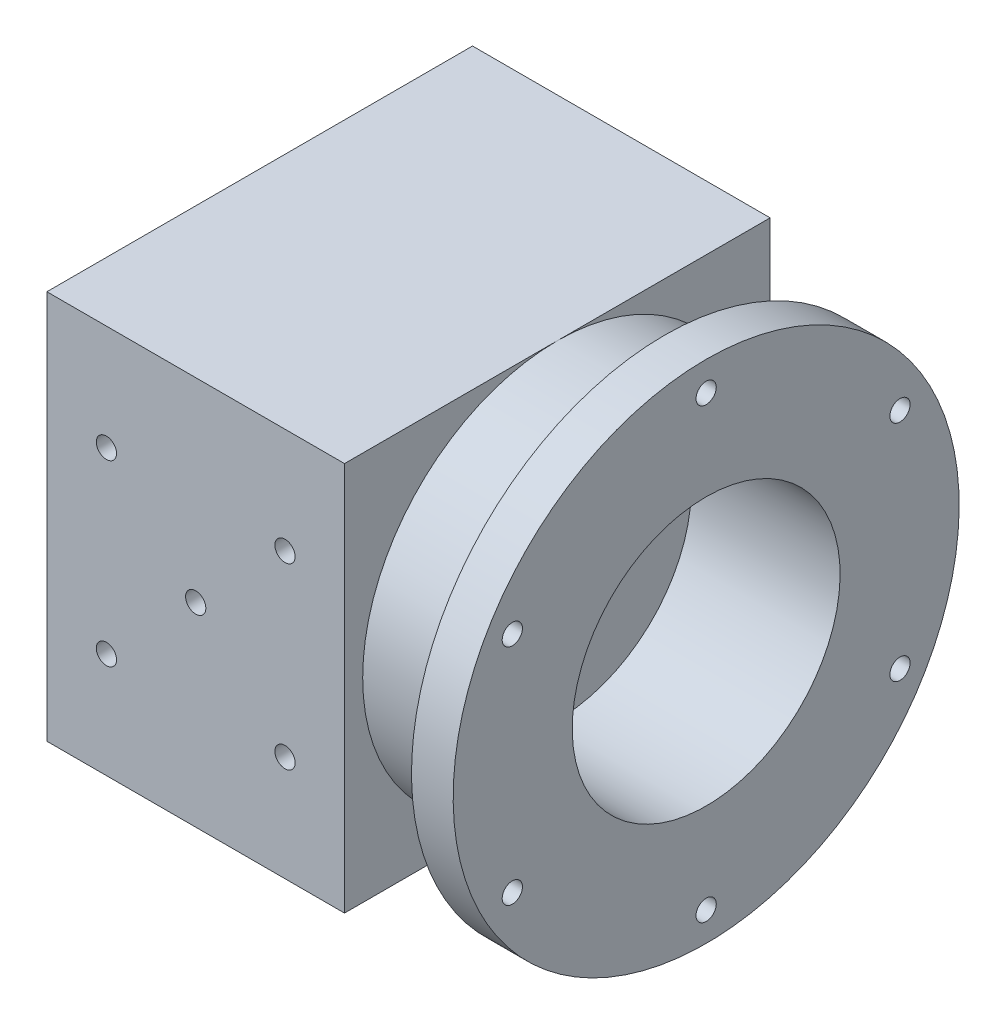
ISO-10303-21;
HEADER;
FILE_DESCRIPTION(('STEP AP214'),'2;1');
FILE_NAME('part.step','',(''),(''),'','','');
FILE_SCHEMA(('AUTOMOTIVE_DESIGN { 1 0 10303 214 1 1 1 1 }'));
ENDSEC;
DATA;
#1=APPLICATION_CONTEXT('core data for automotive mechanical design processes');
#2=APPLICATION_PROTOCOL_DEFINITION('international standard','automotive_design',2000,#1);
#3=PRODUCT_CONTEXT('',#1,'mechanical');
#4=PRODUCT('Part','Part','',(#3));
#5=PRODUCT_RELATED_PRODUCT_CATEGORY('part','',(#4));
#6=PRODUCT_DEFINITION_FORMATION('','',#4);
#7=PRODUCT_DEFINITION_CONTEXT('part definition',#1,'design');
#8=PRODUCT_DEFINITION('design','',#6,#7);
#9=PRODUCT_DEFINITION_SHAPE('','',#8);
#10=(LENGTH_UNIT() NAMED_UNIT(*) SI_UNIT(.MILLI.,.METRE.));
#11=(NAMED_UNIT(*) PLANE_ANGLE_UNIT() SI_UNIT($,.RADIAN.));
#12=(NAMED_UNIT(*) SI_UNIT($,.STERADIAN.) SOLID_ANGLE_UNIT());
#13=UNCERTAINTY_MEASURE_WITH_UNIT(LENGTH_MEASURE(1.E-05),#10,'distance_accuracy_value','');
#14=(GEOMETRIC_REPRESENTATION_CONTEXT(3) GLOBAL_UNCERTAINTY_ASSIGNED_CONTEXT((#13)) GLOBAL_UNIT_ASSIGNED_CONTEXT((#10,
#11,#12)) REPRESENTATION_CONTEXT('',''));
#15=CARTESIAN_POINT('',(0.,0.,0.));
#16=DIRECTION('',(0.,0.,1.));
#17=DIRECTION('',(1.,0.,0.));
#18=AXIS2_PLACEMENT_3D('',#15,#16,#17);
#19=CARTESIAN_POINT('',(50.,0.,0.));
#20=DIRECTION('',(-1.,0.,0.));
#21=DIRECTION('',(0.,-1.,0.));
#22=AXIS2_PLACEMENT_3D('',#19,#20,#21);
#23=CYLINDRICAL_SURFACE('',#22,32.7);
#24=CARTESIAN_POINT('',(25.,0.,0.));
#25=DIRECTION('',(1.,0.,0.));
#26=DIRECTION('',(0.,1.,0.));
#27=AXIS2_PLACEMENT_3D('',#24,#25,#26);
#28=CIRCLE('',#27,32.7);
#29=CARTESIAN_POINT('',(25.,32.7,0.));
#30=VERTEX_POINT('',#29);
#31=EDGE_CURVE('E47',#30,#30,#28,.T.);
#32=ORIENTED_EDGE('',*,*,#31,.T.);
#33=EDGE_LOOP('',(#32));
#34=FACE_BOUND('',#33,.T.);
#35=CARTESIAN_POINT('',(43.,0.,0.));
#36=DIRECTION('',(1.,0.,0.));
#37=DIRECTION('',(0.,1.,0.));
#38=AXIS2_PLACEMENT_3D('',#35,#36,#37);
#39=CIRCLE('',#38,32.7);
#40=CARTESIAN_POINT('',(43.,32.7,0.));
#41=VERTEX_POINT('',#40);
#42=EDGE_CURVE('E11',#41,#41,#39,.T.);
#43=ORIENTED_EDGE('',*,*,#42,.F.);
#44=EDGE_LOOP('',(#43));
#45=FACE_BOUND('',#44,.T.);
#46=ADVANCED_FACE('F41',(#34,#45),#23,.T.);
#47=CARTESIAN_POINT('',(50.,0.,0.));
#48=DIRECTION('',(1.,0.,0.));
#49=DIRECTION('',(0.,1.,0.));
#50=AXIS2_PLACEMENT_3D('',#47,#48,#49);
#51=PLANE('',#50);
#52=CARTESIAN_POINT('',(50.,37.6,0.));
#53=DIRECTION('',(1.,0.,0.));
#54=DIRECTION('',(0.,0.,-1.));
#55=AXIS2_PLACEMENT_3D('',#52,#53,#54);
#56=CIRCLE('',#55,1.69999999999999);
#57=CARTESIAN_POINT('',(50.,37.6,-1.69999999999999));
#58=VERTEX_POINT('',#57);
#59=EDGE_CURVE('E99',#58,#58,#56,.T.);
#60=ORIENTED_EDGE('',*,*,#59,.F.);
#61=EDGE_LOOP('',(#60));
#62=FACE_BOUND('',#61,.T.);
#63=CARTESIAN_POINT('',(50.,18.8000000000014,-32.5625551822957));
#64=DIRECTION('',(1.,0.,0.));
#65=DIRECTION('',(0.,0.,-1.));
#66=AXIS2_PLACEMENT_3D('',#63,#64,#65);
#67=CIRCLE('',#66,1.69999999999999);
#68=CARTESIAN_POINT('',(50.,18.8000000000014,-34.2625551822957));
#69=VERTEX_POINT('',#68);
#70=EDGE_CURVE('E93',#69,#69,#67,.T.);
#71=ORIENTED_EDGE('',*,*,#70,.F.);
#72=EDGE_LOOP('',(#71));
#73=FACE_BOUND('',#72,.T.);
#74=CARTESIAN_POINT('',(50.,-18.7999999999986,-32.5625551822973));
#75=DIRECTION('',(1.,0.,0.));
#76=DIRECTION('',(0.,0.,-1.));
#77=AXIS2_PLACEMENT_3D('',#74,#75,#76);
#78=CIRCLE('',#77,1.69999999999999);
#79=CARTESIAN_POINT('',(50.,-18.7999999999986,-34.2625551822973));
#80=VERTEX_POINT('',#79);
#81=EDGE_CURVE('E87',#80,#80,#78,.T.);
#82=ORIENTED_EDGE('',*,*,#81,.F.);
#83=EDGE_LOOP('',(#82));
#84=FACE_BOUND('',#83,.T.);
#85=CARTESIAN_POINT('',(50.,-37.6,-3.19155473092361E-12));
#86=DIRECTION('',(1.,0.,0.));
#87=DIRECTION('',(0.,0.,-1.));
#88=AXIS2_PLACEMENT_3D('',#85,#86,#87);
#89=CIRCLE('',#88,1.69999999999999);
#90=CARTESIAN_POINT('',(50.,-37.6,-1.70000000000318));
#91=VERTEX_POINT('',#90);
#92=EDGE_CURVE('E81',#91,#91,#89,.T.);
#93=ORIENTED_EDGE('',*,*,#92,.F.);
#94=EDGE_LOOP('',(#93));
#95=FACE_BOUND('',#94,.T.);
#96=CARTESIAN_POINT('',(50.,-18.8000000000014,32.5625551822925));
#97=DIRECTION('',(1.,0.,0.));
#98=DIRECTION('',(0.,0.,-1.));
#99=AXIS2_PLACEMENT_3D('',#96,#97,#98);
#100=CIRCLE('',#99,1.69999999999999);
#101=CARTESIAN_POINT('',(50.,-18.8000000000014,30.8625551822925));
#102=VERTEX_POINT('',#101);
#103=EDGE_CURVE('E75',#102,#102,#100,.T.);
#104=ORIENTED_EDGE('',*,*,#103,.F.);
#105=EDGE_LOOP('',(#104));
#106=FACE_BOUND('',#105,.T.);
#107=CARTESIAN_POINT('',(50.,18.7999999999986,32.5625551822941));
#108=DIRECTION('',(1.,0.,0.));
#109=DIRECTION('',(0.,0.,-1.));
#110=AXIS2_PLACEMENT_3D('',#107,#108,#109);
#111=CIRCLE('',#110,1.69999999999999);
#112=CARTESIAN_POINT('',(50.,18.7999999999986,30.8625551822941));
#113=VERTEX_POINT('',#112);
#114=EDGE_CURVE('E69',#113,#113,#111,.T.);
#115=ORIENTED_EDGE('',*,*,#114,.F.);
#116=EDGE_LOOP('',(#115));
#117=FACE_BOUND('',#116,.T.);
#118=CARTESIAN_POINT('',(50.,0.,0.));
#119=DIRECTION('',(1.,0.,0.));
#120=DIRECTION('',(0.,1.,0.));
#121=AXIS2_PLACEMENT_3D('',#118,#119,#120);
#122=CIRCLE('',#121,22.5);
#123=CARTESIAN_POINT('',(50.,22.5,0.));
#124=VERTEX_POINT('',#123);
#125=EDGE_CURVE('E51',#124,#124,#122,.T.);
#126=ORIENTED_EDGE('',*,*,#125,.F.);
#127=EDGE_LOOP('',(#126));
#128=FACE_BOUND('',#127,.T.);
#129=CARTESIAN_POINT('',(50.,0.,0.));
#130=DIRECTION('',(1.,0.,0.));
#131=DIRECTION('',(0.,1.,0.));
#132=AXIS2_PLACEMENT_3D('',#129,#130,#131);
#133=CIRCLE('',#132,42.5);
#134=CARTESIAN_POINT('',(50.,42.5,0.));
#135=VERTEX_POINT('',#134);
#136=EDGE_CURVE('E61',#135,#135,#133,.T.);
#137=ORIENTED_EDGE('',*,*,#136,.T.);
#138=EDGE_LOOP('',(#137));
#139=FACE_BOUND('',#138,.T.);
#140=ADVANCED_FACE('F105',(#62,#73,#84,#95,#106,#117,#128,#139),#51,.T.);
#141=CARTESIAN_POINT('',(25.,0.,0.));
#142=DIRECTION('',(1.,0.,0.));
#143=DIRECTION('',(0.,1.,0.));
#144=AXIS2_PLACEMENT_3D('',#141,#142,#143);
#145=PLANE('',#144);
#146=ORIENTED_EDGE('',*,*,#31,.F.);
#147=EDGE_LOOP('',(#146));
#148=FACE_BOUND('',#147,.T.);
#149=CARTESIAN_POINT('',(25.,0.,0.));
#150=DIRECTION('',(1.,0.,0.));
#151=DIRECTION('',(0.,1.,0.));
#152=AXIS2_PLACEMENT_3D('',#149,#150,#151);
#153=CIRCLE('',#152,22.5);
#154=CARTESIAN_POINT('',(25.,22.5,0.));
#155=VERTEX_POINT('',#154);
#156=EDGE_CURVE('E55',#155,#155,#153,.T.);
#157=ORIENTED_EDGE('',*,*,#156,.T.);
#158=EDGE_LOOP('',(#157));
#159=FACE_BOUND('',#158,.T.);
#160=ADVANCED_FACE('F108',(#148,#159),#145,.F.);
#161=CARTESIAN_POINT('',(50.,0.,0.));
#162=DIRECTION('',(-1.,0.,0.));
#163=DIRECTION('',(0.,-1.,0.));
#164=AXIS2_PLACEMENT_3D('',#161,#162,#163);
#165=CYLINDRICAL_SURFACE('',#164,22.5);
#166=ORIENTED_EDGE('',*,*,#125,.T.);
#167=EDGE_LOOP('',(#166));
#168=FACE_BOUND('',#167,.T.);
#169=ORIENTED_EDGE('',*,*,#156,.F.);
#170=EDGE_LOOP('',(#169));
#171=FACE_BOUND('',#170,.T.);
#172=ADVANCED_FACE('F127',(#168,#171),#165,.F.);
#173=CARTESIAN_POINT('',(43.,0.,0.));
#174=DIRECTION('',(1.,0.,0.));
#175=DIRECTION('',(0.,1.,0.));
#176=AXIS2_PLACEMENT_3D('',#173,#174,#175);
#177=CYLINDRICAL_SURFACE('',#176,42.5);
#178=CARTESIAN_POINT('',(43.,0.,0.));
#179=DIRECTION('',(1.,0.,0.));
#180=DIRECTION('',(0.,1.,0.));
#181=AXIS2_PLACEMENT_3D('',#178,#179,#180);
#182=CIRCLE('',#181,42.5);
#183=CARTESIAN_POINT('',(43.,42.5,0.));
#184=VERTEX_POINT('',#183);
#185=EDGE_CURVE('E59',#184,#184,#182,.T.);
#186=ORIENTED_EDGE('',*,*,#185,.T.);
#187=EDGE_LOOP('',(#186));
#188=FACE_BOUND('',#187,.T.);
#189=ORIENTED_EDGE('',*,*,#136,.F.);
#190=EDGE_LOOP('',(#189));
#191=FACE_BOUND('',#190,.T.);
#192=ADVANCED_FACE('F124',(#188,#191),#177,.T.);
#193=CARTESIAN_POINT('',(43.,0.,0.));
#194=DIRECTION('',(1.,0.,0.));
#195=DIRECTION('',(0.,1.,0.));
#196=AXIS2_PLACEMENT_3D('',#193,#194,#195);
#197=PLANE('',#196);
#198=CARTESIAN_POINT('',(43.,37.6,0.));
#199=DIRECTION('',(1.,0.,0.));
#200=DIRECTION('',(0.,1.,0.));
#201=AXIS2_PLACEMENT_3D('',#198,#199,#200);
#202=CIRCLE('',#201,1.69999999999999);
#203=CARTESIAN_POINT('',(43.,39.3,0.));
#204=VERTEX_POINT('',#203);
#205=EDGE_CURVE('E96',#204,#204,#202,.T.);
#206=ORIENTED_EDGE('',*,*,#205,.T.);
#207=EDGE_LOOP('',(#206));
#208=FACE_BOUND('',#207,.T.);
#209=CARTESIAN_POINT('',(43.,18.8000000000014,-32.5625551822957));
#210=DIRECTION('',(1.,0.,0.));
#211=DIRECTION('',(0.,1.,0.));
#212=AXIS2_PLACEMENT_3D('',#209,#210,#211);
#213=CIRCLE('',#212,1.69999999999999);
#214=CARTESIAN_POINT('',(43.,20.5000000000014,-32.5625551822957));
#215=VERTEX_POINT('',#214);
#216=EDGE_CURVE('E90',#215,#215,#213,.T.);
#217=ORIENTED_EDGE('',*,*,#216,.T.);
#218=EDGE_LOOP('',(#217));
#219=FACE_BOUND('',#218,.T.);
#220=CARTESIAN_POINT('',(43.,-18.7999999999986,-32.5625551822973));
#221=DIRECTION('',(1.,0.,0.));
#222=DIRECTION('',(0.,1.,0.));
#223=AXIS2_PLACEMENT_3D('',#220,#221,#222);
#224=CIRCLE('',#223,1.69999999999999);
#225=CARTESIAN_POINT('',(43.,-17.0999999999986,-32.5625551822973));
#226=VERTEX_POINT('',#225);
#227=EDGE_CURVE('E84',#226,#226,#224,.T.);
#228=ORIENTED_EDGE('',*,*,#227,.T.);
#229=EDGE_LOOP('',(#228));
#230=FACE_BOUND('',#229,.T.);
#231=CARTESIAN_POINT('',(43.,-37.6,-3.19155473092361E-12));
#232=DIRECTION('',(1.,0.,0.));
#233=DIRECTION('',(0.,1.,0.));
#234=AXIS2_PLACEMENT_3D('',#231,#232,#233);
#235=CIRCLE('',#234,1.69999999999999);
#236=CARTESIAN_POINT('',(43.,-35.9,-3.19155473092361E-12));
#237=VERTEX_POINT('',#236);
#238=EDGE_CURVE('E78',#237,#237,#235,.T.);
#239=ORIENTED_EDGE('',*,*,#238,.T.);
#240=EDGE_LOOP('',(#239));
#241=FACE_BOUND('',#240,.T.);
#242=CARTESIAN_POINT('',(43.,-18.8000000000014,32.5625551822925));
#243=DIRECTION('',(1.,0.,0.));
#244=DIRECTION('',(0.,1.,0.));
#245=AXIS2_PLACEMENT_3D('',#242,#243,#244);
#246=CIRCLE('',#245,1.69999999999999);
#247=CARTESIAN_POINT('',(43.,-17.1000000000014,32.5625551822925));
#248=VERTEX_POINT('',#247);
#249=EDGE_CURVE('E72',#248,#248,#246,.T.);
#250=ORIENTED_EDGE('',*,*,#249,.T.);
#251=EDGE_LOOP('',(#250));
#252=FACE_BOUND('',#251,.T.);
#253=CARTESIAN_POINT('',(43.,18.7999999999986,32.5625551822941));
#254=DIRECTION('',(1.,0.,0.));
#255=DIRECTION('',(0.,1.,0.));
#256=AXIS2_PLACEMENT_3D('',#253,#254,#255);
#257=CIRCLE('',#256,1.69999999999999);
#258=CARTESIAN_POINT('',(43.,20.4999999999986,32.5625551822941));
#259=VERTEX_POINT('',#258);
#260=EDGE_CURVE('E64',#259,#259,#257,.T.);
#261=ORIENTED_EDGE('',*,*,#260,.T.);
#262=EDGE_LOOP('',(#261));
#263=FACE_BOUND('',#262,.T.);
#264=ORIENTED_EDGE('',*,*,#42,.T.);
#265=EDGE_LOOP('',(#264));
#266=FACE_BOUND('',#265,.T.);
#267=ORIENTED_EDGE('',*,*,#185,.F.);
#268=EDGE_LOOP('',(#267));
#269=FACE_BOUND('',#268,.T.);
#270=ADVANCED_FACE('F126',(#208,#219,#230,#241,#252,#263,#266,#269),#197,.F.);
#271=CARTESIAN_POINT('',(50.,18.7999999999986,32.5625551822941));
#272=DIRECTION('',(1.,0.,0.));
#273=DIRECTION('',(0.,0.,-1.));
#274=AXIS2_PLACEMENT_3D('',#271,#272,#273);
#275=CYLINDRICAL_SURFACE('',#274,1.69999999999999);
#276=ORIENTED_EDGE('',*,*,#260,.F.);
#277=EDGE_LOOP('',(#276));
#278=FACE_BOUND('',#277,.T.);
#279=ORIENTED_EDGE('',*,*,#114,.T.);
#280=EDGE_LOOP('',(#279));
#281=FACE_BOUND('',#280,.T.);
#282=ADVANCED_FACE('F134',(#278,#281),#275,.F.);
#283=CARTESIAN_POINT('',(50.,-18.8000000000014,32.5625551822925));
#284=DIRECTION('',(1.,0.,0.));
#285=DIRECTION('',(0.,0.,-1.));
#286=AXIS2_PLACEMENT_3D('',#283,#284,#285);
#287=CYLINDRICAL_SURFACE('',#286,1.69999999999999);
#288=ORIENTED_EDGE('',*,*,#249,.F.);
#289=EDGE_LOOP('',(#288));
#290=FACE_BOUND('',#289,.T.);
#291=ORIENTED_EDGE('',*,*,#103,.T.);
#292=EDGE_LOOP('',(#291));
#293=FACE_BOUND('',#292,.T.);
#294=ADVANCED_FACE('F185',(#290,#293),#287,.F.);
#295=CARTESIAN_POINT('',(50.,-37.6,-3.19155473092361E-12));
#296=DIRECTION('',(1.,0.,0.));
#297=DIRECTION('',(0.,0.,-1.));
#298=AXIS2_PLACEMENT_3D('',#295,#296,#297);
#299=CYLINDRICAL_SURFACE('',#298,1.69999999999999);
#300=ORIENTED_EDGE('',*,*,#238,.F.);
#301=EDGE_LOOP('',(#300));
#302=FACE_BOUND('',#301,.T.);
#303=ORIENTED_EDGE('',*,*,#92,.T.);
#304=EDGE_LOOP('',(#303));
#305=FACE_BOUND('',#304,.T.);
#306=ADVANCED_FACE('F194',(#302,#305),#299,.F.);
#307=CARTESIAN_POINT('',(50.,-18.7999999999986,-32.5625551822973));
#308=DIRECTION('',(1.,0.,0.));
#309=DIRECTION('',(0.,0.,-1.));
#310=AXIS2_PLACEMENT_3D('',#307,#308,#309);
#311=CYLINDRICAL_SURFACE('',#310,1.69999999999999);
#312=ORIENTED_EDGE('',*,*,#227,.F.);
#313=EDGE_LOOP('',(#312));
#314=FACE_BOUND('',#313,.T.);
#315=ORIENTED_EDGE('',*,*,#81,.T.);
#316=EDGE_LOOP('',(#315));
#317=FACE_BOUND('',#316,.T.);
#318=ADVANCED_FACE('F203',(#314,#317),#311,.F.);
#319=CARTESIAN_POINT('',(50.,18.8000000000014,-32.5625551822957));
#320=DIRECTION('',(1.,0.,0.));
#321=DIRECTION('',(0.,0.,-1.));
#322=AXIS2_PLACEMENT_3D('',#319,#320,#321);
#323=CYLINDRICAL_SURFACE('',#322,1.69999999999999);
#324=ORIENTED_EDGE('',*,*,#216,.F.);
#325=EDGE_LOOP('',(#324));
#326=FACE_BOUND('',#325,.T.);
#327=ORIENTED_EDGE('',*,*,#70,.T.);
#328=EDGE_LOOP('',(#327));
#329=FACE_BOUND('',#328,.T.);
#330=ADVANCED_FACE('F212',(#326,#329),#323,.F.);
#331=CARTESIAN_POINT('',(50.,37.6,0.));
#332=DIRECTION('',(1.,0.,0.));
#333=DIRECTION('',(0.,0.,-1.));
#334=AXIS2_PLACEMENT_3D('',#331,#332,#333);
#335=CYLINDRICAL_SURFACE('',#334,1.69999999999999);
#336=ORIENTED_EDGE('',*,*,#205,.F.);
#337=EDGE_LOOP('',(#336));
#338=FACE_BOUND('',#337,.T.);
#339=ORIENTED_EDGE('',*,*,#59,.T.);
#340=EDGE_LOOP('',(#339));
#341=FACE_BOUND('',#340,.T.);
#342=ADVANCED_FACE('F103',(#338,#341),#335,.F.);
#343=CLOSED_SHELL('',(#46,#140,#160,#172,#192,#270,#282,#294,#306,#318,#330,#342));
#344=MANIFOLD_SOLID_BREP('B2',#343);
#345=CARTESIAN_POINT('',(0.,0.,35.75));
#346=DIRECTION('',(0.,0.,-1.));
#347=DIRECTION('',(-1.,0.,0.));
#348=AXIS2_PLACEMENT_3D('',#345,#346,#347);
#349=PLANE('',#348);
#350=CARTESIAN_POINT('',(15.,15.,35.75));
#351=DIRECTION('',(0.,0.,1.));
#352=DIRECTION('',(1.,0.,0.));
#353=AXIS2_PLACEMENT_3D('',#350,#351,#352);
#354=CIRCLE('',#353,1.69999999999999);
#355=CARTESIAN_POINT('',(16.7,15.,35.75));
#356=VERTEX_POINT('',#355);
#357=EDGE_CURVE('E365',#356,#356,#354,.T.);
#358=ORIENTED_EDGE('',*,*,#357,.F.);
#359=EDGE_LOOP('',(#358));
#360=FACE_BOUND('',#359,.T.);
#361=CARTESIAN_POINT('',(-15.,-15.,35.75));
#362=DIRECTION('',(0.,0.,1.));
#363=DIRECTION('',(1.,0.,0.));
#364=AXIS2_PLACEMENT_3D('',#361,#362,#363);
#365=CIRCLE('',#364,1.69999999999999);
#366=CARTESIAN_POINT('',(-13.3,-15.,35.75));
#367=VERTEX_POINT('',#366);
#368=EDGE_CURVE('E359',#367,#367,#365,.T.);
#369=ORIENTED_EDGE('',*,*,#368,.F.);
#370=EDGE_LOOP('',(#369));
#371=FACE_BOUND('',#370,.T.);
#372=CARTESIAN_POINT('',(-15.,15.,35.75));
#373=DIRECTION('',(0.,0.,1.));
#374=DIRECTION('',(1.,0.,0.));
#375=AXIS2_PLACEMENT_3D('',#372,#373,#374);
#376=CIRCLE('',#375,1.69999999999999);
#377=CARTESIAN_POINT('',(-13.3,15.,35.75));
#378=VERTEX_POINT('',#377);
#379=EDGE_CURVE('E353',#378,#378,#376,.T.);
#380=ORIENTED_EDGE('',*,*,#379,.F.);
#381=EDGE_LOOP('',(#380));
#382=FACE_BOUND('',#381,.T.);
#383=CARTESIAN_POINT('',(15.,-15.,35.75));
#384=DIRECTION('',(0.,0.,1.));
#385=DIRECTION('',(1.,0.,0.));
#386=AXIS2_PLACEMENT_3D('',#383,#384,#385);
#387=CIRCLE('',#386,1.69999999999999);
#388=CARTESIAN_POINT('',(16.7,-15.,35.75));
#389=VERTEX_POINT('',#388);
#390=EDGE_CURVE('E347',#389,#389,#387,.T.);
#391=ORIENTED_EDGE('',*,*,#390,.F.);
#392=EDGE_LOOP('',(#391));
#393=FACE_BOUND('',#392,.T.);
#394=DIRECTION('',(0.,1.,0.));
#395=VECTOR('',#394,1.);
#396=CARTESIAN_POINT('',(25.,32.7,35.75));
#397=LINE('',#396,#395);
#398=CARTESIAN_POINT('',(25.,-32.7,35.75));
#399=VERTEX_POINT('',#398);
#400=CARTESIAN_POINT('',(25.,32.7,35.75));
#401=VERTEX_POINT('',#400);
#402=EDGE_CURVE('E315',#399,#401,#397,.T.);
#403=ORIENTED_EDGE('',*,*,#402,.T.);
#404=DIRECTION('',(-1.,0.,0.));
#405=VECTOR('',#404,1.);
#406=CARTESIAN_POINT('',(-25.,32.7,35.75));
#407=LINE('',#406,#405);
#408=CARTESIAN_POINT('',(-25.,32.7,35.75));
#409=VERTEX_POINT('',#408);
#410=EDGE_CURVE('E310',#401,#409,#407,.T.);
#411=ORIENTED_EDGE('',*,*,#410,.T.);
#412=DIRECTION('',(0.,-1.,0.));
#413=VECTOR('',#412,1.);
#414=CARTESIAN_POINT('',(-25.,32.7,35.75));
#415=LINE('',#414,#413);
#416=CARTESIAN_POINT('',(-25.,-32.7,35.75));
#417=VERTEX_POINT('',#416);
#418=EDGE_CURVE('E313',#409,#417,#415,.T.);
#419=ORIENTED_EDGE('',*,*,#418,.T.);
#420=DIRECTION('',(1.,0.,0.));
#421=VECTOR('',#420,1.);
#422=CARTESIAN_POINT('',(25.,-32.7,35.75));
#423=LINE('',#422,#421);
#424=EDGE_CURVE('E280',#417,#399,#423,.T.);
#425=ORIENTED_EDGE('',*,*,#424,.T.);
#426=EDGE_LOOP('',(#403,#411,#419,#425));
#427=FACE_BOUND('',#426,.T.);
#428=CARTESIAN_POINT('',(0.,0.,35.75));
#429=DIRECTION('',(0.,0.,1.));
#430=DIRECTION('',(1.,0.,0.));
#431=AXIS2_PLACEMENT_3D('',#428,#429,#430);
#432=CIRCLE('',#431,1.69999999999999);
#433=CARTESIAN_POINT('',(1.69999999999999,0.,35.75));
#434=VERTEX_POINT('',#433);
#435=EDGE_CURVE('E344',#434,#434,#432,.T.);
#436=ORIENTED_EDGE('',*,*,#435,.F.);
#437=EDGE_LOOP('',(#436));
#438=FACE_BOUND('',#437,.T.);
#439=ADVANCED_FACE('F262',(#360,#371,#382,#393,#427,#438),#349,.F.);
#440=CARTESIAN_POINT('',(25.,32.7,35.75));
#441=DIRECTION('',(-1.,0.,0.));
#442=DIRECTION('',(0.,0.,1.));
#443=AXIS2_PLACEMENT_3D('',#440,#441,#442);
#444=PLANE('',#443);
#445=DIRECTION('',(0.,1.,0.));
#446=VECTOR('',#445,1.);
#447=CARTESIAN_POINT('',(25.,32.7,-35.75));
#448=LINE('',#447,#446);
#449=CARTESIAN_POINT('',(25.,-32.7,-35.75));
#450=VERTEX_POINT('',#449);
#451=CARTESIAN_POINT('',(25.,32.7,-35.75));
#452=VERTEX_POINT('',#451);
#453=EDGE_CURVE('E328',#450,#452,#448,.T.);
#454=ORIENTED_EDGE('',*,*,#453,.T.);
#455=DIRECTION('',(0.,0.,-1.));
#456=VECTOR('',#455,1.);
#457=CARTESIAN_POINT('',(25.,32.7,35.75));
#458=LINE('',#457,#456);
#459=EDGE_CURVE('E39',#401,#452,#458,.T.);
#460=ORIENTED_EDGE('',*,*,#459,.F.);
#461=ORIENTED_EDGE('',*,*,#402,.F.);
#462=DIRECTION('',(0.,0.,-1.));
#463=VECTOR('',#462,1.);
#464=CARTESIAN_POINT('',(25.,-32.7,35.75));
#465=LINE('',#464,#463);
#466=EDGE_CURVE('E324',#399,#450,#465,.T.);
#467=ORIENTED_EDGE('',*,*,#466,.T.);
#468=EDGE_LOOP('',(#454,#460,#461,#467));
#469=FACE_BOUND('',#468,.T.);
#470=ADVANCED_FACE('F264',(#469),#444,.F.);
#471=CARTESIAN_POINT('',(-25.,32.7,35.75));
#472=DIRECTION('',(0.,-1.,0.));
#473=DIRECTION('',(0.,0.,-1.));
#474=AXIS2_PLACEMENT_3D('',#471,#472,#473);
#475=PLANE('',#474);
#476=DIRECTION('',(-1.,0.,0.));
#477=VECTOR('',#476,1.);
#478=CARTESIAN_POINT('',(-25.,32.7,-35.75));
#479=LINE('',#478,#477);
#480=CARTESIAN_POINT('',(-25.,32.7,-35.75));
#481=VERTEX_POINT('',#480);
#482=EDGE_CURVE('E319',#452,#481,#479,.T.);
#483=ORIENTED_EDGE('',*,*,#482,.T.);
#484=DIRECTION('',(0.,0.,-1.));
#485=VECTOR('',#484,1.);
#486=CARTESIAN_POINT('',(-25.,32.7,35.75));
#487=LINE('',#486,#485);
#488=EDGE_CURVE('E272',#409,#481,#487,.T.);
#489=ORIENTED_EDGE('',*,*,#488,.F.);
#490=ORIENTED_EDGE('',*,*,#410,.F.);
#491=ORIENTED_EDGE('',*,*,#459,.T.);
#492=EDGE_LOOP('',(#483,#489,#490,#491));
#493=FACE_BOUND('',#492,.T.);
#494=ADVANCED_FACE('F318',(#493),#475,.F.);
#495=CARTESIAN_POINT('',(-25.,32.7,35.75));
#496=DIRECTION('',(1.,0.,0.));
#497=DIRECTION('',(0.,1.,0.));
#498=AXIS2_PLACEMENT_3D('',#495,#496,#497);
#499=PLANE('',#498);
#500=DIRECTION('',(0.,-1.,0.));
#501=VECTOR('',#500,1.);
#502=CARTESIAN_POINT('',(-25.,32.7,-35.75));
#503=LINE('',#502,#501);
#504=CARTESIAN_POINT('',(-25.,-32.7,-35.75));
#505=VERTEX_POINT('',#504);
#506=EDGE_CURVE('E297',#481,#505,#503,.T.);
#507=ORIENTED_EDGE('',*,*,#506,.T.);
#508=DIRECTION('',(0.,0.,-1.));
#509=VECTOR('',#508,1.);
#510=CARTESIAN_POINT('',(-25.,-32.7,35.75));
#511=LINE('',#510,#509);
#512=EDGE_CURVE('E320',#417,#505,#511,.T.);
#513=ORIENTED_EDGE('',*,*,#512,.F.);
#514=ORIENTED_EDGE('',*,*,#418,.F.);
#515=ORIENTED_EDGE('',*,*,#488,.T.);
#516=EDGE_LOOP('',(#507,#513,#514,#515));
#517=FACE_BOUND('',#516,.T.);
#518=ADVANCED_FACE('F322',(#517),#499,.F.);
#519=CARTESIAN_POINT('',(25.,-32.7,35.75));
#520=DIRECTION('',(0.,1.,0.));
#521=DIRECTION('',(-1.,0.,0.));
#522=AXIS2_PLACEMENT_3D('',#519,#520,#521);
#523=PLANE('',#522);
#524=DIRECTION('',(1.,0.,0.));
#525=VECTOR('',#524,1.);
#526=CARTESIAN_POINT('',(25.,-32.7,-35.75));
#527=LINE('',#526,#525);
#528=EDGE_CURVE('E303',#505,#450,#527,.T.);
#529=ORIENTED_EDGE('',*,*,#528,.T.);
#530=ORIENTED_EDGE('',*,*,#466,.F.);
#531=ORIENTED_EDGE('',*,*,#424,.F.);
#532=ORIENTED_EDGE('',*,*,#512,.T.);
#533=EDGE_LOOP('',(#529,#530,#531,#532));
#534=FACE_BOUND('',#533,.T.);
#535=ADVANCED_FACE('F336',(#534),#523,.F.);
#536=CARTESIAN_POINT('',(0.,0.,-35.75));
#537=DIRECTION('',(0.,0.,-1.));
#538=DIRECTION('',(-1.,0.,0.));
#539=AXIS2_PLACEMENT_3D('',#536,#537,#538);
#540=PLANE('',#539);
#541=CARTESIAN_POINT('',(15.,15.,-35.75));
#542=DIRECTION('',(0.,0.,-1.));
#543=DIRECTION('',(-1.,0.,0.));
#544=AXIS2_PLACEMENT_3D('',#541,#542,#543);
#545=CIRCLE('',#544,1.69999999999999);
#546=CARTESIAN_POINT('',(13.3,15.,-35.75));
#547=VERTEX_POINT('',#546);
#548=EDGE_CURVE('E362',#547,#547,#545,.T.);
#549=ORIENTED_EDGE('',*,*,#548,.F.);
#550=EDGE_LOOP('',(#549));
#551=FACE_BOUND('',#550,.T.);
#552=CARTESIAN_POINT('',(-15.,-15.,-35.75));
#553=DIRECTION('',(0.,0.,-1.));
#554=DIRECTION('',(-1.,0.,0.));
#555=AXIS2_PLACEMENT_3D('',#552,#553,#554);
#556=CIRCLE('',#555,1.69999999999999);
#557=CARTESIAN_POINT('',(-16.7,-15.,-35.75));
#558=VERTEX_POINT('',#557);
#559=EDGE_CURVE('E356',#558,#558,#556,.T.);
#560=ORIENTED_EDGE('',*,*,#559,.F.);
#561=EDGE_LOOP('',(#560));
#562=FACE_BOUND('',#561,.T.);
#563=CARTESIAN_POINT('',(-15.,15.,-35.75));
#564=DIRECTION('',(0.,0.,-1.));
#565=DIRECTION('',(-1.,0.,0.));
#566=AXIS2_PLACEMENT_3D('',#563,#564,#565);
#567=CIRCLE('',#566,1.69999999999999);
#568=CARTESIAN_POINT('',(-16.7,15.,-35.75));
#569=VERTEX_POINT('',#568);
#570=EDGE_CURVE('E350',#569,#569,#567,.T.);
#571=ORIENTED_EDGE('',*,*,#570,.F.);
#572=EDGE_LOOP('',(#571));
#573=FACE_BOUND('',#572,.T.);
#574=CARTESIAN_POINT('',(15.,-15.,-35.75));
#575=DIRECTION('',(0.,0.,-1.));
#576=DIRECTION('',(-1.,0.,0.));
#577=AXIS2_PLACEMENT_3D('',#574,#575,#576);
#578=CIRCLE('',#577,1.69999999999999);
#579=CARTESIAN_POINT('',(13.3,-15.,-35.75));
#580=VERTEX_POINT('',#579);
#581=EDGE_CURVE('E266',#580,#580,#578,.T.);
#582=ORIENTED_EDGE('',*,*,#581,.F.);
#583=EDGE_LOOP('',(#582));
#584=FACE_BOUND('',#583,.T.);
#585=CARTESIAN_POINT('',(0.,0.,-35.75));
#586=DIRECTION('',(0.,0.,-1.));
#587=DIRECTION('',(-1.,0.,0.));
#588=AXIS2_PLACEMENT_3D('',#585,#586,#587);
#589=CIRCLE('',#588,1.69999999999999);
#590=CARTESIAN_POINT('',(-1.69999999999999,0.,-35.75));
#591=VERTEX_POINT('',#590);
#592=EDGE_CURVE('E331',#591,#591,#589,.T.);
#593=ORIENTED_EDGE('',*,*,#592,.F.);
#594=EDGE_LOOP('',(#593));
#595=FACE_BOUND('',#594,.T.);
#596=ORIENTED_EDGE('',*,*,#453,.F.);
#597=ORIENTED_EDGE('',*,*,#528,.F.);
#598=ORIENTED_EDGE('',*,*,#506,.F.);
#599=ORIENTED_EDGE('',*,*,#482,.F.);
#600=EDGE_LOOP('',(#596,#597,#598,#599));
#601=FACE_BOUND('',#600,.T.);
#602=ADVANCED_FACE('F339',(#551,#562,#573,#584,#595,#601),#540,.T.);
#603=CARTESIAN_POINT('',(0.,0.,35.75));
#604=DIRECTION('',(0.,0.,1.));
#605=DIRECTION('',(1.,0.,0.));
#606=AXIS2_PLACEMENT_3D('',#603,#604,#605);
#607=CYLINDRICAL_SURFACE('',#606,1.69999999999999);
#608=ORIENTED_EDGE('',*,*,#592,.T.);
#609=EDGE_LOOP('',(#608));
#610=FACE_BOUND('',#609,.T.);
#611=ORIENTED_EDGE('',*,*,#435,.T.);
#612=EDGE_LOOP('',(#611));
#613=FACE_BOUND('',#612,.T.);
#614=ADVANCED_FACE('F383',(#610,#613),#607,.F.);
#615=CARTESIAN_POINT('',(15.,-15.,35.75));
#616=DIRECTION('',(0.,0.,1.));
#617=DIRECTION('',(1.,0.,0.));
#618=AXIS2_PLACEMENT_3D('',#615,#616,#617);
#619=CYLINDRICAL_SURFACE('',#618,1.69999999999999);
#620=ORIENTED_EDGE('',*,*,#581,.T.);
#621=EDGE_LOOP('',(#620));
#622=FACE_BOUND('',#621,.T.);
#623=ORIENTED_EDGE('',*,*,#390,.T.);
#624=EDGE_LOOP('',(#623));
#625=FACE_BOUND('',#624,.T.);
#626=ADVANCED_FACE('F380',(#622,#625),#619,.F.);
#627=CARTESIAN_POINT('',(-15.,15.,35.75));
#628=DIRECTION('',(0.,0.,1.));
#629=DIRECTION('',(1.,0.,0.));
#630=AXIS2_PLACEMENT_3D('',#627,#628,#629);
#631=CYLINDRICAL_SURFACE('',#630,1.69999999999999);
#632=ORIENTED_EDGE('',*,*,#570,.T.);
#633=EDGE_LOOP('',(#632));
#634=FACE_BOUND('',#633,.T.);
#635=ORIENTED_EDGE('',*,*,#379,.T.);
#636=EDGE_LOOP('',(#635));
#637=FACE_BOUND('',#636,.T.);
#638=ADVANCED_FACE('F382',(#634,#637),#631,.F.);
#639=CARTESIAN_POINT('',(-15.,-15.,35.75));
#640=DIRECTION('',(0.,0.,1.));
#641=DIRECTION('',(1.,0.,0.));
#642=AXIS2_PLACEMENT_3D('',#639,#640,#641);
#643=CYLINDRICAL_SURFACE('',#642,1.69999999999999);
#644=ORIENTED_EDGE('',*,*,#559,.T.);
#645=EDGE_LOOP('',(#644));
#646=FACE_BOUND('',#645,.T.);
#647=ORIENTED_EDGE('',*,*,#368,.T.);
#648=EDGE_LOOP('',(#647));
#649=FACE_BOUND('',#648,.T.);
#650=ADVANCED_FACE('F390',(#646,#649),#643,.F.);
#651=CARTESIAN_POINT('',(15.,15.,35.75));
#652=DIRECTION('',(0.,0.,1.));
#653=DIRECTION('',(1.,0.,0.));
#654=AXIS2_PLACEMENT_3D('',#651,#652,#653);
#655=CYLINDRICAL_SURFACE('',#654,1.69999999999999);
#656=ORIENTED_EDGE('',*,*,#548,.T.);
#657=EDGE_LOOP('',(#656));
#658=FACE_BOUND('',#657,.T.);
#659=ORIENTED_EDGE('',*,*,#357,.T.);
#660=EDGE_LOOP('',(#659));
#661=FACE_BOUND('',#660,.T.);
#662=ADVANCED_FACE('F369',(#658,#661),#655,.F.);
#663=CLOSED_SHELL('',(#439,#470,#494,#518,#535,#602,#614,#626,#638,#650,#662));
#664=MANIFOLD_SOLID_BREP('B6',#663);
#665=ADVANCED_BREP_SHAPE_REPRESENTATION('',(#18,#344,#664),#14);
#666=SHAPE_DEFINITION_REPRESENTATION(#9,#665);
ENDSEC;
END-ISO-10303-21;
